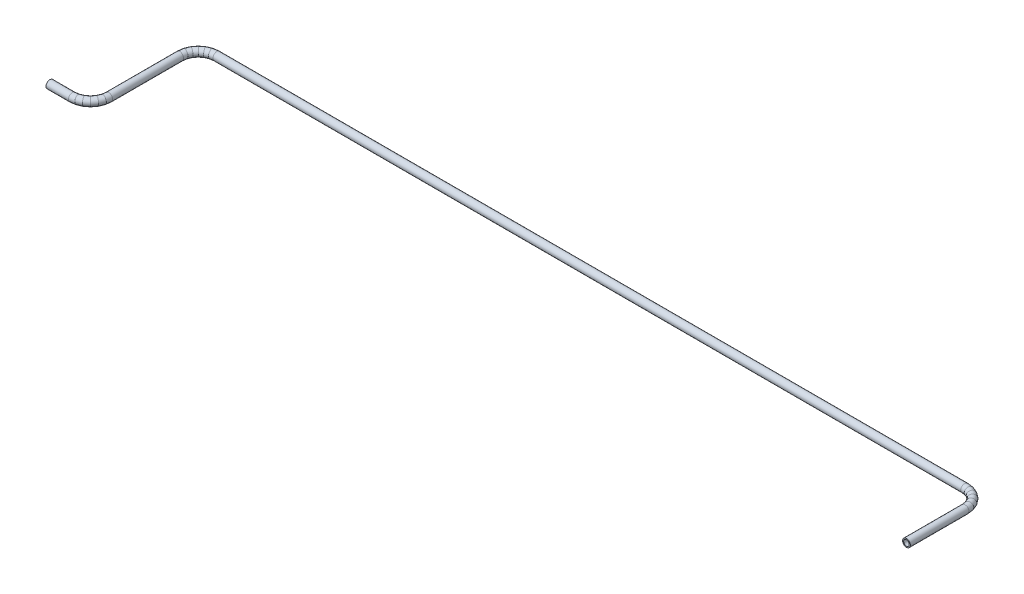
ISO-10303-21;
HEADER;
FILE_DESCRIPTION(('STEP AP214'),'2;1');
FILE_NAME('part.step','',(''),(''),'','','');
FILE_SCHEMA(('AUTOMOTIVE_DESIGN { 1 0 10303 214 1 1 1 1 }'));
ENDSEC;
DATA;
#1=APPLICATION_CONTEXT('core data for automotive mechanical design processes');
#2=APPLICATION_PROTOCOL_DEFINITION('international standard','automotive_design',2000,#1);
#3=PRODUCT_CONTEXT('',#1,'mechanical');
#4=PRODUCT('Part','Part','',(#3));
#5=PRODUCT_RELATED_PRODUCT_CATEGORY('part','',(#4));
#6=PRODUCT_DEFINITION_FORMATION('','',#4);
#7=PRODUCT_DEFINITION_CONTEXT('part definition',#1,'design');
#8=PRODUCT_DEFINITION('design','',#6,#7);
#9=PRODUCT_DEFINITION_SHAPE('','',#8);
#10=(LENGTH_UNIT() NAMED_UNIT(*) SI_UNIT(.MILLI.,.METRE.));
#11=(NAMED_UNIT(*) PLANE_ANGLE_UNIT() SI_UNIT($,.RADIAN.));
#12=(NAMED_UNIT(*) SI_UNIT($,.STERADIAN.) SOLID_ANGLE_UNIT());
#13=UNCERTAINTY_MEASURE_WITH_UNIT(LENGTH_MEASURE(1.E-05),#10,'distance_accuracy_value','');
#14=(GEOMETRIC_REPRESENTATION_CONTEXT(3) GLOBAL_UNCERTAINTY_ASSIGNED_CONTEXT((#13)) GLOBAL_UNIT_ASSIGNED_CONTEXT((#10,
#11,#12)) REPRESENTATION_CONTEXT('',''));
#15=CARTESIAN_POINT('',(0.,0.,0.));
#16=DIRECTION('',(0.,0.,1.));
#17=DIRECTION('',(1.,0.,0.));
#18=AXIS2_PLACEMENT_3D('',#15,#16,#17);
#19=CARTESIAN_POINT('',(-2911.59277838077,0.,-73.3289105438826));
#20=DIRECTION('',(0.,0.,1.));
#21=DIRECTION('',(0.,-1.,0.));
#22=AXIS2_PLACEMENT_3D('',#19,#20,#21);
#23=CYLINDRICAL_SURFACE('',#22,3.175);
#24=CARTESIAN_POINT('',(-2911.59277838077,0.,-73.0000000000001));
#25=DIRECTION('',(0.065403129230125,0.,0.997858923238605));
#26=DIRECTION('',(0.997858923238605,0.,-0.065403129230125));
#27=AXIS2_PLACEMENT_3D('',#24,#25,#26);
#28=ELLIPSE('',#27,3.18181250481317,3.175);
#29=CARTESIAN_POINT('',(-2908.41777838077,0.,-73.2081004944384));
#30=VERTEX_POINT('',#29);
#31=EDGE_CURVE('E45',#30,#30,#28,.F.);
#32=ORIENTED_EDGE('',*,*,#31,.F.);
#33=EDGE_LOOP('',(#32));
#34=FACE_BOUND('',#33,.T.);
#35=CARTESIAN_POINT('',(-2911.59277838077,0.,-25.299999999997));
#36=DIRECTION('',(0.,0.,1.));
#37=DIRECTION('',(1.,0.,0.));
#38=AXIS2_PLACEMENT_3D('',#35,#36,#37);
#39=CIRCLE('',#38,3.175);
#40=CARTESIAN_POINT('',(-2908.41777838077,0.,-25.299999999997));
#41=VERTEX_POINT('',#40);
#42=EDGE_CURVE('E116',#41,#41,#39,.T.);
#43=ORIENTED_EDGE('',*,*,#42,.F.);
#44=EDGE_LOOP('',(#43));
#45=FACE_BOUND('',#44,.T.);
#46=ADVANCED_FACE('F39',(#34,#45),#23,.T.);
#47=CARTESIAN_POINT('',(-2912.17695907214,0.,-77.4372928890044));
#48=DIRECTION('',(0.130526192220016,0.,0.991444861373815));
#49=DIRECTION('',(0.991444861373815,0.,-0.130526192220016));
#50=AXIS2_PLACEMENT_3D('',#47,#48,#49);
#51=CYLINDRICAL_SURFACE('',#50,3.175);
#52=CARTESIAN_POINT('',(-2912.10389098644,0.,-76.8822856765381));
#53=DIRECTION('',(0.258819045102501,0.,0.965925826289074));
#54=DIRECTION('',(0.965925826289074,0.,-0.258819045102501));
#55=AXIS2_PLACEMENT_3D('',#52,#53,#54);
#56=ELLIPSE('',#55,3.20239694984199,3.175);
#57=CARTESIAN_POINT('',(-2909.01061306656,0.,-77.7111269971354));
#58=VERTEX_POINT('',#57);
#59=EDGE_CURVE('E177',#58,#58,#56,.F.);
#60=ORIENTED_EDGE('',*,*,#59,.F.);
#61=EDGE_LOOP('',(#60));
#62=FACE_BOUND('',#61,.T.);
#63=ORIENTED_EDGE('',*,*,#31,.T.);
#64=EDGE_LOOP('',(#63));
#65=FACE_BOUND('',#64,.T.);
#66=ADVANCED_FACE('F183',(#62,#65),#51,.T.);
#67=CARTESIAN_POINT('',(-2913.81662211182,0.,-81.0171843881302));
#68=DIRECTION('',(0.382683432365085,0.,0.923879532511289));
#69=DIRECTION('',(0.923879532511289,0.,-0.382683432365085));
#70=AXIS2_PLACEMENT_3D('',#67,#68,#69);
#71=CYLINDRICAL_SURFACE('',#70,3.175);
#72=CARTESIAN_POINT('',(-2913.60239732401,0.,-80.5000000000008));
#73=DIRECTION('',(0.500000000000009,0.,0.866025403784433));
#74=DIRECTION('',(0.866025403784433,0.,-0.500000000000009));
#75=AXIS2_PLACEMENT_3D('',#72,#73,#74);
#76=ELLIPSE('',#75,3.20239694984199,3.175);
#77=CARTESIAN_POINT('',(-2910.82904021244,0.,-82.1011984749218));
#78=VERTEX_POINT('',#77);
#79=EDGE_CURVE('E176',#78,#78,#76,.F.);
#80=ORIENTED_EDGE('',*,*,#79,.F.);
#81=EDGE_LOOP('',(#80));
#82=FACE_BOUND('',#81,.T.);
#83=ORIENTED_EDGE('',*,*,#59,.T.);
#84=EDGE_LOOP('',(#83));
#85=FACE_BOUND('',#84,.T.);
#86=ADVANCED_FACE('F602',(#82,#85),#71,.T.);
#87=CARTESIAN_POINT('',(-2916.32695908763,0.,-84.0507180202281));
#88=DIRECTION('',(0.608761429008742,0.,0.793353340291219));
#89=DIRECTION('',(0.793353340291219,0.,-0.608761429008742));
#90=AXIS2_PLACEMENT_3D('',#87,#88,#89);
#91=CYLINDRICAL_SURFACE('',#90,3.175);
#92=CARTESIAN_POINT('',(-2915.98617666298,0.,-83.6066017177989));
#93=DIRECTION('',(0.707106781186549,0.,0.707106781186546));
#94=DIRECTION('',(0.707106781186546,0.,-0.707106781186549));
#95=AXIS2_PLACEMENT_3D('',#92,#93,#94);
#96=ELLIPSE('',#95,3.20239694984198,3.175);
#97=CARTESIAN_POINT('',(-2913.72174006369,0.,-85.8710383170833));
#98=VERTEX_POINT('',#97);
#99=EDGE_CURVE('E174',#98,#98,#96,.F.);
#100=ORIENTED_EDGE('',*,*,#99,.F.);
#101=EDGE_LOOP('',(#100));
#102=FACE_BOUND('',#101,.T.);
#103=ORIENTED_EDGE('',*,*,#79,.T.);
#104=EDGE_LOOP('',(#103));
#105=FACE_BOUND('',#104,.T.);
#106=ADVANCED_FACE('F592',(#102,#105),#91,.T.);
#107=CARTESIAN_POINT('',(-2919.5368946832,0.,-86.331163481423));
#108=DIRECTION('',(0.793353340291223,0.,0.608761429008737));
#109=DIRECTION('',(0.608761429008737,0.,-0.793353340291223));
#110=AXIS2_PLACEMENT_3D('',#107,#108,#109);
#111=CYLINDRICAL_SURFACE('',#110,3.175);
#112=CARTESIAN_POINT('',(-2919.09277838077,0.,-85.9903810567672));
#113=DIRECTION('',(0.866025403784438,0.,0.500000000000001));
#114=DIRECTION('',(0.500000000000001,0.,-0.866025403784438));
#115=AXIS2_PLACEMENT_3D('',#112,#113,#114);
#116=ELLIPSE('',#115,3.20239694984199,3.175);
#117=CARTESIAN_POINT('',(-2917.49157990585,0.,-88.7637381683321));
#118=VERTEX_POINT('',#117);
#119=EDGE_CURVE('E168',#118,#118,#116,.F.);
#120=ORIENTED_EDGE('',*,*,#119,.F.);
#121=EDGE_LOOP('',(#120));
#122=FACE_BOUND('',#121,.T.);
#123=ORIENTED_EDGE('',*,*,#99,.T.);
#124=EDGE_LOOP('',(#123));
#125=FACE_BOUND('',#124,.T.);
#126=ADVANCED_FACE('F584',(#122,#125),#111,.T.);
#127=CARTESIAN_POINT('',(-2923.22767709237,0.,-87.7031121821474));
#128=DIRECTION('',(0.923879532511294,0.,0.382683432365073));
#129=DIRECTION('',(0.382683432365073,0.,-0.923879532511294));
#130=AXIS2_PLACEMENT_3D('',#127,#128,#129);
#131=CYLINDRICAL_SURFACE('',#130,3.175);
#132=CARTESIAN_POINT('',(-2922.71049270424,0.,-87.4888873943369));
#133=DIRECTION('',(0.965925826289071,0.,0.25881904510251));
#134=DIRECTION('',(0.25881904510251,0.,-0.965925826289071));
#135=AXIS2_PLACEMENT_3D('',#132,#133,#134);
#136=ELLIPSE('',#135,3.20239694984198,3.175);
#137=CARTESIAN_POINT('',(-2921.88165138364,0.,-90.5821653142186));
#138=VERTEX_POINT('',#137);
#139=EDGE_CURVE('E170',#138,#138,#136,.F.);
#140=ORIENTED_EDGE('',*,*,#139,.F.);
#141=EDGE_LOOP('',(#140));
#142=FACE_BOUND('',#141,.T.);
#143=ORIENTED_EDGE('',*,*,#119,.T.);
#144=EDGE_LOOP('',(#143));
#145=FACE_BOUND('',#144,.T.);
#146=ADVANCED_FACE('F576',(#142,#145),#131,.T.);
#147=CARTESIAN_POINT('',(-2926.91887504936,0.,-88.0429314408749));
#148=DIRECTION('',(0.991444861373811,0.,0.130526192220047));
#149=DIRECTION('',(0.130526192220047,0.,-0.991444861373811));
#150=AXIS2_PLACEMENT_3D('',#147,#148,#149);
#151=CYLINDRICAL_SURFACE('',#150,3.175);
#152=CARTESIAN_POINT('',(-2926.59277838077,0.,-88.0000000000009));
#153=DIRECTION('',(0.997858923238604,0.,0.0654031292301407));
#154=DIRECTION('',(0.0654031292301407,0.,-0.997858923238604));
#155=AXIS2_PLACEMENT_3D('',#152,#153,#154);
#156=ELLIPSE('',#155,3.18181250481318,3.175);
#157=CARTESIAN_POINT('',(-2926.38467788634,0.,-91.1750000000008));
#158=VERTEX_POINT('',#157);
#159=EDGE_CURVE('E163',#158,#158,#156,.F.);
#160=ORIENTED_EDGE('',*,*,#159,.F.);
#161=EDGE_LOOP('',(#160));
#162=FACE_BOUND('',#161,.T.);
#163=ORIENTED_EDGE('',*,*,#139,.T.);
#164=EDGE_LOOP('',(#163));
#165=FACE_BOUND('',#164,.T.);
#166=ADVANCED_FACE('F570',(#162,#165),#151,.T.);
#167=CARTESIAN_POINT('',(-3538.02168892466,0.,-88.0000000000009));
#168=DIRECTION('',(1.,0.,0.));
#169=DIRECTION('',(0.,0.,-1.));
#170=AXIS2_PLACEMENT_3D('',#167,#168,#169);
#171=CYLINDRICAL_SURFACE('',#170,3.175);
#172=CARTESIAN_POINT('',(-3537.69277838077,0.,-88.0000000000005));
#173=DIRECTION('',(0.997858923238603,0.,-0.0654031292301481));
#174=DIRECTION('',(-0.0654031292301481,0.,-0.997858923238603));
#175=AXIS2_PLACEMENT_3D('',#172,#173,#174);
#176=ELLIPSE('',#175,3.18181250481318,3.175);
#177=CARTESIAN_POINT('',(-3537.90087887521,0.,-91.1750000000005));
#178=VERTEX_POINT('',#177);
#179=EDGE_CURVE('E161',#178,#178,#176,.F.);
#180=ORIENTED_EDGE('',*,*,#179,.F.);
#181=EDGE_LOOP('',(#180));
#182=FACE_BOUND('',#181,.T.);
#183=ORIENTED_EDGE('',*,*,#159,.T.);
#184=EDGE_LOOP('',(#183));
#185=FACE_BOUND('',#184,.T.);
#186=ADVANCED_FACE('F559',(#182,#185),#171,.T.);
#187=CARTESIAN_POINT('',(-3542.13007126978,0.,-87.4158193086363));
#188=DIRECTION('',(0.991444861373809,0.,-0.130526192220062));
#189=DIRECTION('',(-0.130526192220062,0.,-0.991444861373809));
#190=AXIS2_PLACEMENT_3D('',#187,#188,#189);
#191=CYLINDRICAL_SURFACE('',#190,3.175);
#192=CARTESIAN_POINT('',(-3541.57506405731,0.,-87.4888873943367));
#193=DIRECTION('',(0.965925826289069,0.,-0.258819045102517));
#194=DIRECTION('',(-0.258819045102517,0.,-0.965925826289069));
#195=AXIS2_PLACEMENT_3D('',#192,#193,#194);
#196=ELLIPSE('',#195,3.20239694984198,3.175);
#197=CARTESIAN_POINT('',(-3542.40390537791,0.,-90.5821653142184));
#198=VERTEX_POINT('',#197);
#199=EDGE_CURVE('E158',#198,#198,#196,.F.);
#200=ORIENTED_EDGE('',*,*,#199,.F.);
#201=EDGE_LOOP('',(#200));
#202=FACE_BOUND('',#201,.T.);
#203=ORIENTED_EDGE('',*,*,#179,.T.);
#204=EDGE_LOOP('',(#203));
#205=FACE_BOUND('',#204,.T.);
#206=ADVANCED_FACE('F548',(#202,#205),#191,.T.);
#207=CARTESIAN_POINT('',(-3545.7099627689,0.,-85.7761562689563));
#208=DIRECTION('',(0.923879532511294,0.,-0.382683432365073));
#209=DIRECTION('',(-0.382683432365073,0.,-0.923879532511294));
#210=AXIS2_PLACEMENT_3D('',#207,#208,#209);
#211=CYLINDRICAL_SURFACE('',#210,3.175);
#212=CARTESIAN_POINT('',(-3545.19277838077,0.,-85.9903810567662));
#213=DIRECTION('',(0.866025403784438,0.,-0.500000000000001));
#214=DIRECTION('',(-0.500000000000001,0.,-0.866025403784438));
#215=AXIS2_PLACEMENT_3D('',#212,#213,#214);
#216=ELLIPSE('',#215,3.20239694984199,3.175);
#217=CARTESIAN_POINT('',(-3546.7939768557,0.,-88.7637381683311));
#218=VERTEX_POINT('',#217);
#219=EDGE_CURVE('E154',#218,#218,#216,.F.);
#220=ORIENTED_EDGE('',*,*,#219,.F.);
#221=EDGE_LOOP('',(#220));
#222=FACE_BOUND('',#221,.T.);
#223=ORIENTED_EDGE('',*,*,#199,.T.);
#224=EDGE_LOOP('',(#223));
#225=FACE_BOUND('',#224,.T.);
#226=ADVANCED_FACE('F539',(#222,#225),#211,.T.);
#227=CARTESIAN_POINT('',(-3548.743496401,0.,-83.2658192931421));
#228=DIRECTION('',(0.793353340291223,0.,-0.608761429008737));
#229=DIRECTION('',(-0.608761429008737,0.,-0.793353340291223));
#230=AXIS2_PLACEMENT_3D('',#227,#228,#229);
#231=CYLINDRICAL_SURFACE('',#230,3.175);
#232=CARTESIAN_POINT('',(-3548.29938009857,0.,-83.6066017177982));
#233=DIRECTION('',(0.70710678118655,0.,-0.707106781186545));
#234=DIRECTION('',(-0.707106781186545,0.,-0.70710678118655));
#235=AXIS2_PLACEMENT_3D('',#232,#233,#234);
#236=ELLIPSE('',#235,3.20239694984197,3.175);
#237=CARTESIAN_POINT('',(-3550.56381669786,0.,-85.8710383170826));
#238=VERTEX_POINT('',#237);
#239=EDGE_CURVE('E155',#238,#238,#236,.F.);
#240=ORIENTED_EDGE('',*,*,#239,.F.);
#241=EDGE_LOOP('',(#240));
#242=FACE_BOUND('',#241,.T.);
#243=ORIENTED_EDGE('',*,*,#219,.T.);
#244=EDGE_LOOP('',(#243));
#245=FACE_BOUND('',#244,.T.);
#246=ADVANCED_FACE('F533',(#242,#245),#231,.T.);
#247=CARTESIAN_POINT('',(-3551.0239418622,0.,-80.0558836975709));
#248=DIRECTION('',(0.608761429008742,0.,-0.793353340291219));
#249=DIRECTION('',(-0.793353340291219,0.,-0.608761429008742));
#250=AXIS2_PLACEMENT_3D('',#247,#248,#249);
#251=CYLINDRICAL_SURFACE('',#250,3.175);
#252=CARTESIAN_POINT('',(-3550.68315943754,0.,-80.4999999999997));
#253=DIRECTION('',(0.500000000000009,0.,-0.866025403784433));
#254=DIRECTION('',(-0.866025403784433,0.,-0.500000000000009));
#255=AXIS2_PLACEMENT_3D('',#252,#253,#254);
#256=ELLIPSE('',#255,3.20239694984199,3.175);
#257=CARTESIAN_POINT('',(-3553.45651654911,0.,-82.1011984749208));
#258=VERTEX_POINT('',#257);
#259=EDGE_CURVE('E149',#258,#258,#256,.F.);
#260=ORIENTED_EDGE('',*,*,#259,.F.);
#261=EDGE_LOOP('',(#260));
#262=FACE_BOUND('',#261,.T.);
#263=ORIENTED_EDGE('',*,*,#239,.T.);
#264=EDGE_LOOP('',(#263));
#265=FACE_BOUND('',#264,.T.);
#266=ADVANCED_FACE('F525',(#262,#265),#251,.T.);
#267=CARTESIAN_POINT('',(-3552.39589056292,0.,-76.3651012884083));
#268=DIRECTION('',(0.382683432365085,0.,-0.923879532511289));
#269=DIRECTION('',(-0.923879532511289,0.,-0.382683432365085));
#270=AXIS2_PLACEMENT_3D('',#267,#268,#269);
#271=CYLINDRICAL_SURFACE('',#270,3.175);
#272=CARTESIAN_POINT('',(-3552.18166577511,0.,-76.8822856765375));
#273=DIRECTION('',(0.258819045102501,0.,-0.965925826289074));
#274=DIRECTION('',(-0.965925826289074,0.,-0.258819045102501));
#275=AXIS2_PLACEMENT_3D('',#272,#273,#274);
#276=ELLIPSE('',#275,3.20239694984199,3.175);
#277=CARTESIAN_POINT('',(-3555.27494369499,0.,-77.7111269971348));
#278=VERTEX_POINT('',#277);
#279=EDGE_CURVE('E148',#278,#278,#276,.F.);
#280=ORIENTED_EDGE('',*,*,#279,.F.);
#281=EDGE_LOOP('',(#280));
#282=FACE_BOUND('',#281,.T.);
#283=ORIENTED_EDGE('',*,*,#259,.T.);
#284=EDGE_LOOP('',(#283));
#285=FACE_BOUND('',#284,.T.);
#286=ADVANCED_FACE('F511',(#282,#285),#271,.T.);
#287=CARTESIAN_POINT('',(-3552.73570982165,0.,-72.6739033314159));
#288=DIRECTION('',(0.130526192220016,0.,-0.991444861373815));
#289=DIRECTION('',(-0.991444861373815,0.,-0.130526192220016));
#290=AXIS2_PLACEMENT_3D('',#287,#288,#289);
#291=CYLINDRICAL_SURFACE('',#290,3.175);
#292=CARTESIAN_POINT('',(-3552.69277838077,0.,-72.9999999999999));
#293=DIRECTION('',(0.065403129230125,0.,-0.997858923238605));
#294=DIRECTION('',(-0.997858923238605,0.,-0.065403129230125));
#295=AXIS2_PLACEMENT_3D('',#292,#293,#294);
#296=ELLIPSE('',#295,3.18181250481317,3.175);
#297=CARTESIAN_POINT('',(-3555.86777838077,0.,-73.2081004944383));
#298=VERTEX_POINT('',#297);
#299=EDGE_CURVE('E141',#298,#298,#296,.F.);
#300=ORIENTED_EDGE('',*,*,#299,.F.);
#301=EDGE_LOOP('',(#300));
#302=FACE_BOUND('',#301,.T.);
#303=ORIENTED_EDGE('',*,*,#279,.T.);
#304=EDGE_LOOP('',(#303));
#305=FACE_BOUND('',#304,.T.);
#306=ADVANCED_FACE('F501',(#302,#305),#291,.T.);
#307=CARTESIAN_POINT('',(-3552.69277838077,0.,-14.6710894561175));
#308=DIRECTION('',(0.,0.,-1.));
#309=DIRECTION('',(0.,1.,0.));
#310=AXIS2_PLACEMENT_3D('',#307,#308,#309);
#311=CYLINDRICAL_SURFACE('',#310,3.175);
#312=CARTESIAN_POINT('',(-3552.69277838077,0.,-14.9999999999999));
#313=DIRECTION('',(0.0654031292301811,0.,-0.997858923238601));
#314=DIRECTION('',(0.997858923238601,0.,0.0654031292301811));
#315=AXIS2_PLACEMENT_3D('',#312,#313,#314);
#316=ELLIPSE('',#315,3.18181250481318,3.175);
#317=CARTESIAN_POINT('',(-3549.51777838077,0.,-14.7918995055614));
#318=VERTEX_POINT('',#317);
#319=EDGE_CURVE('E139',#318,#318,#316,.F.);
#320=ORIENTED_EDGE('',*,*,#319,.F.);
#321=EDGE_LOOP('',(#320));
#322=FACE_BOUND('',#321,.T.);
#323=ORIENTED_EDGE('',*,*,#299,.T.);
#324=EDGE_LOOP('',(#323));
#325=FACE_BOUND('',#324,.T.);
#326=ADVANCED_FACE('F494',(#322,#325),#311,.T.);
#327=CARTESIAN_POINT('',(-3553.27695907214,0.,-10.5627071109957));
#328=DIRECTION('',(0.130526192220127,0.,-0.991444861373801));
#329=DIRECTION('',(-0.991444861373801,0.,-0.130526192220127));
#330=AXIS2_PLACEMENT_3D('',#327,#328,#329);
#331=CYLINDRICAL_SURFACE('',#330,3.175);
#332=CARTESIAN_POINT('',(-3553.20389098644,0.,-11.1177143234617));
#333=DIRECTION('',(0.258819045102555,0.,-0.965925826289059));
#334=DIRECTION('',(0.965925826289059,0.,0.258819045102555));
#335=AXIS2_PLACEMENT_3D('',#332,#333,#334);
#336=ELLIPSE('',#335,3.20239694984197,3.175);
#337=CARTESIAN_POINT('',(-3550.11061306656,0.,-10.2888730028642));
#338=VERTEX_POINT('',#337);
#339=EDGE_CURVE('E140',#338,#338,#336,.F.);
#340=ORIENTED_EDGE('',*,*,#339,.F.);
#341=EDGE_LOOP('',(#340));
#342=FACE_BOUND('',#341,.T.);
#343=ORIENTED_EDGE('',*,*,#319,.T.);
#344=EDGE_LOOP('',(#343));
#345=FACE_BOUND('',#344,.T.);
#346=ADVANCED_FACE('F486',(#342,#345),#331,.T.);
#347=CARTESIAN_POINT('',(-3554.91662211182,0.,-6.98281561186986));
#348=DIRECTION('',(0.382683432365086,0.,-0.923879532511288));
#349=DIRECTION('',(-0.923879532511289,0.,-0.382683432365086));
#350=AXIS2_PLACEMENT_3D('',#347,#348,#349);
#351=CYLINDRICAL_SURFACE('',#350,3.175);
#352=CARTESIAN_POINT('',(-3554.70239732401,0.,-7.49999999999945));
#353=DIRECTION('',(0.49999999999997,0.,-0.866025403784456));
#354=DIRECTION('',(0.866025403784456,0.,0.49999999999997));
#355=AXIS2_PLACEMENT_3D('',#352,#353,#354);
#356=ELLIPSE('',#355,3.20239694984197,3.175);
#357=CARTESIAN_POINT('',(-3551.92904021244,0.,-5.89880152507856));
#358=VERTEX_POINT('',#357);
#359=EDGE_CURVE('E131',#358,#358,#356,.F.);
#360=ORIENTED_EDGE('',*,*,#359,.F.);
#361=EDGE_LOOP('',(#360));
#362=FACE_BOUND('',#361,.T.);
#363=ORIENTED_EDGE('',*,*,#339,.T.);
#364=EDGE_LOOP('',(#363));
#365=FACE_BOUND('',#364,.T.);
#366=ADVANCED_FACE('F480',(#362,#365),#351,.T.);
#367=CARTESIAN_POINT('',(-3557.42695908763,0.,-3.94928197977196));
#368=DIRECTION('',(0.60876142900867,0.,-0.793353340291274));
#369=DIRECTION('',(-0.793353340291274,0.,-0.60876142900867));
#370=AXIS2_PLACEMENT_3D('',#367,#368,#369);
#371=CYLINDRICAL_SURFACE('',#370,3.175);
#372=CARTESIAN_POINT('',(-3557.08617666298,0.,-4.39339828220139));
#373=DIRECTION('',(0.707106781186542,0.,-0.707106781186553));
#374=DIRECTION('',(0.707106781186553,0.,0.707106781186542));
#375=AXIS2_PLACEMENT_3D('',#372,#373,#374);
#376=ELLIPSE('',#375,3.20239694984201,3.175);
#377=CARTESIAN_POINT('',(-3554.82174006369,0.,-2.12896168291701));
#378=VERTEX_POINT('',#377);
#379=EDGE_CURVE('E132',#378,#378,#376,.F.);
#380=ORIENTED_EDGE('',*,*,#379,.F.);
#381=EDGE_LOOP('',(#380));
#382=FACE_BOUND('',#381,.T.);
#383=ORIENTED_EDGE('',*,*,#359,.T.);
#384=EDGE_LOOP('',(#383));
#385=FACE_BOUND('',#384,.T.);
#386=ADVANCED_FACE('F467',(#382,#385),#371,.T.);
#387=CARTESIAN_POINT('',(-3560.6368946832,0.,-1.66883651857797));
#388=DIRECTION('',(0.793353340291265,0.,-0.608761429008682));
#389=DIRECTION('',(-0.608761429008682,0.,-0.793353340291265));
#390=AXIS2_PLACEMENT_3D('',#387,#388,#389);
#391=CYLINDRICAL_SURFACE('',#390,3.175);
#392=CARTESIAN_POINT('',(-3560.19277838077,0.,-2.00961894323346));
#393=DIRECTION('',(0.866025403784444,0.,-0.49999999999999));
#394=DIRECTION('',(0.49999999999999,0.,0.866025403784444));
#395=AXIS2_PLACEMENT_3D('',#392,#393,#394);
#396=ELLIPSE('',#395,3.20239694984197,3.175);
#397=CARTESIAN_POINT('',(-3558.59157990585,0.,0.763738168331504));
#398=VERTEX_POINT('',#397);
#399=EDGE_CURVE('E126',#398,#398,#396,.F.);
#400=ORIENTED_EDGE('',*,*,#399,.F.);
#401=EDGE_LOOP('',(#400));
#402=FACE_BOUND('',#401,.T.);
#403=ORIENTED_EDGE('',*,*,#379,.T.);
#404=EDGE_LOOP('',(#403));
#405=FACE_BOUND('',#404,.T.);
#406=ADVANCED_FACE('F459',(#402,#405),#391,.T.);
#407=CARTESIAN_POINT('',(-3564.32767709237,0.,-0.296887817853309));
#408=DIRECTION('',(0.923879532511277,0.,-0.382683432365114));
#409=DIRECTION('',(-0.382683432365114,0.,-0.923879532511277));
#410=AXIS2_PLACEMENT_3D('',#407,#408,#409);
#411=CYLINDRICAL_SURFACE('',#410,3.175);
#412=CARTESIAN_POINT('',(-3563.81049270424,0.,-0.511112605663966));
#413=DIRECTION('',(0.965925826289065,0.,-0.258819045102532));
#414=DIRECTION('',(0.258819045102532,0.,0.965925826289065));
#415=AXIS2_PLACEMENT_3D('',#412,#413,#414);
#416=ELLIPSE('',#415,3.20239694984199,3.175);
#417=CARTESIAN_POINT('',(-3562.98165138364,0.,2.58216531421774));
#418=VERTEX_POINT('',#417);
#419=EDGE_CURVE('E124',#418,#418,#416,.F.);
#420=ORIENTED_EDGE('',*,*,#419,.F.);
#421=EDGE_LOOP('',(#420));
#422=FACE_BOUND('',#421,.T.);
#423=ORIENTED_EDGE('',*,*,#399,.T.);
#424=EDGE_LOOP('',(#423));
#425=FACE_BOUND('',#424,.T.);
#426=ADVANCED_FACE('F448',(#422,#425),#411,.T.);
#427=CARTESIAN_POINT('',(-3568.01887504936,0.,0.0429314408739723));
#428=DIRECTION('',(0.991444861373811,0.,-0.130526192220048));
#429=DIRECTION('',(-0.130526192220048,0.,-0.991444861373811));
#430=AXIS2_PLACEMENT_3D('',#427,#428,#429);
#431=CYLINDRICAL_SURFACE('',#430,3.175);
#432=CARTESIAN_POINT('',(-3567.69277838077,0.,0.));
#433=DIRECTION('',(0.997858923238604,0.,-0.0654031292301411));
#434=DIRECTION('',(0.0654031292301411,0.,0.997858923238604));
#435=AXIS2_PLACEMENT_3D('',#432,#433,#434);
#436=ELLIPSE('',#435,3.18181250481318,3.175);
#437=CARTESIAN_POINT('',(-3567.48467788634,0.,3.175));
#438=VERTEX_POINT('',#437);
#439=EDGE_CURVE('E125',#438,#438,#436,.F.);
#440=ORIENTED_EDGE('',*,*,#439,.F.);
#441=EDGE_LOOP('',(#440));
#442=FACE_BOUND('',#441,.T.);
#443=ORIENTED_EDGE('',*,*,#419,.T.);
#444=EDGE_LOOP('',(#443));
#445=FACE_BOUND('',#444,.T.);
#446=ADVANCED_FACE('F204',(#442,#445),#431,.T.);
#447=CARTESIAN_POINT('',(-3585.89277838077,0.,0.));
#448=DIRECTION('',(1.,0.,0.));
#449=DIRECTION('',(0.,0.,-1.));
#450=AXIS2_PLACEMENT_3D('',#447,#448,#449);
#451=CYLINDRICAL_SURFACE('',#450,3.175);
#452=CARTESIAN_POINT('',(-3585.89277838077,0.,0.));
#453=DIRECTION('',(1.,0.,0.));
#454=DIRECTION('',(0.,0.,-1.));
#455=AXIS2_PLACEMENT_3D('',#452,#453,#454);
#456=CIRCLE('',#455,3.175);
#457=CARTESIAN_POINT('',(-3585.89277838077,0.,-3.175));
#458=VERTEX_POINT('',#457);
#459=EDGE_CURVE('E117',#458,#458,#456,.T.);
#460=ORIENTED_EDGE('',*,*,#459,.T.);
#461=EDGE_LOOP('',(#460));
#462=FACE_BOUND('',#461,.T.);
#463=ORIENTED_EDGE('',*,*,#439,.T.);
#464=EDGE_LOOP('',(#463));
#465=FACE_BOUND('',#464,.T.);
#466=ADVANCED_FACE('F193',(#462,#465),#451,.T.);
#467=CARTESIAN_POINT('',(-2911.59277838077,0.,-25.299999999997));
#468=DIRECTION('',(0.,0.,1.));
#469=DIRECTION('',(1.,0.,0.));
#470=AXIS2_PLACEMENT_3D('',#467,#468,#469);
#471=PLANE('',#470);
#472=CARTESIAN_POINT('',(-2911.59277838077,0.,-25.299999999997));
#473=DIRECTION('',(0.,0.,1.));
#474=DIRECTION('',(1.,0.,0.));
#475=AXIS2_PLACEMENT_3D('',#472,#473,#474);
#476=CIRCLE('',#475,2.286);
#477=CARTESIAN_POINT('',(-2909.30677838077,0.,-25.299999999997));
#478=VERTEX_POINT('',#477);
#479=EDGE_CURVE('E114',#478,#478,#476,.F.);
#480=ORIENTED_EDGE('',*,*,#479,.T.);
#481=EDGE_LOOP('',(#480));
#482=FACE_BOUND('',#481,.T.);
#483=ORIENTED_EDGE('',*,*,#42,.T.);
#484=EDGE_LOOP('',(#483));
#485=FACE_BOUND('',#484,.T.);
#486=ADVANCED_FACE('F191',(#482,#485),#471,.T.);
#487=CARTESIAN_POINT('',(-3585.89277838077,0.,0.));
#488=DIRECTION('',(1.,0.,0.));
#489=DIRECTION('',(0.,0.,-1.));
#490=AXIS2_PLACEMENT_3D('',#487,#488,#489);
#491=PLANE('',#490);
#492=CARTESIAN_POINT('',(-3585.89277838077,0.,0.));
#493=DIRECTION('',(1.,0.,0.));
#494=DIRECTION('',(0.,0.,-1.));
#495=AXIS2_PLACEMENT_3D('',#492,#493,#494);
#496=CIRCLE('',#495,2.286);
#497=CARTESIAN_POINT('',(-3585.89277838077,0.,-2.286));
#498=VERTEX_POINT('',#497);
#499=EDGE_CURVE('E46',#498,#498,#496,.F.);
#500=ORIENTED_EDGE('',*,*,#499,.F.);
#501=EDGE_LOOP('',(#500));
#502=FACE_BOUND('',#501,.T.);
#503=ORIENTED_EDGE('',*,*,#459,.F.);
#504=EDGE_LOOP('',(#503));
#505=FACE_BOUND('',#504,.T.);
#506=ADVANCED_FACE('F192',(#502,#505),#491,.F.);
#507=CARTESIAN_POINT('',(-2911.59277838077,0.,-73.2648155915956));
#508=DIRECTION('',(0.,0.,1.));
#509=DIRECTION('',(0.,-1.,0.));
#510=AXIS2_PLACEMENT_3D('',#507,#508,#509);
#511=CYLINDRICAL_SURFACE('',#510,2.286);
#512=CARTESIAN_POINT('',(-2911.59277838077,0.,-73.0000000000001));
#513=DIRECTION('',(0.065403129230125,0.,0.997858923238605));
#514=DIRECTION('',(0.997858923238605,0.,-0.065403129230125));
#515=AXIS2_PLACEMENT_3D('',#512,#513,#514);
#516=ELLIPSE('',#515,2.29090500346548,2.286);
#517=CARTESIAN_POINT('',(-2909.30677838077,0.,-73.1498323559957));
#518=VERTEX_POINT('',#517);
#519=EDGE_CURVE('E109',#518,#518,#516,.T.);
#520=ORIENTED_EDGE('',*,*,#519,.F.);
#521=EDGE_LOOP('',(#520));
#522=FACE_BOUND('',#521,.T.);
#523=ORIENTED_EDGE('',*,*,#479,.F.);
#524=EDGE_LOOP('',(#523));
#525=FACE_BOUND('',#524,.T.);
#526=ADVANCED_FACE('F203',(#522,#525),#511,.F.);
#527=CARTESIAN_POINT('',(-2912.16015474152,0.,-77.3096513256326));
#528=DIRECTION('',(0.130526192220016,0.,0.991444861373815));
#529=DIRECTION('',(0.991444861373815,0.,-0.130526192220016));
#530=AXIS2_PLACEMENT_3D('',#527,#528,#529);
#531=CYLINDRICAL_SURFACE('',#530,2.286);
#532=CARTESIAN_POINT('',(-2912.10389098644,0.,-76.8822856765381));
#533=DIRECTION('',(0.258819045102501,0.,0.965925826289074));
#534=DIRECTION('',(0.965925826289074,0.,-0.258819045102501));
#535=AXIS2_PLACEMENT_3D('',#532,#533,#534);
#536=ELLIPSE('',#535,2.30572580388623,2.286);
#537=CARTESIAN_POINT('',(-2909.87673088412,0.,-77.4790514273681));
#538=VERTEX_POINT('',#537);
#539=EDGE_CURVE('E110',#538,#538,#536,.T.);
#540=ORIENTED_EDGE('',*,*,#539,.F.);
#541=EDGE_LOOP('',(#540));
#542=FACE_BOUND('',#541,.T.);
#543=ORIENTED_EDGE('',*,*,#519,.T.);
#544=EDGE_LOOP('',(#543));
#545=FACE_BOUND('',#544,.T.);
#546=ADVANCED_FACE('F288',(#542,#545),#531,.F.);
#547=CARTESIAN_POINT('',(-2913.76735430734,0.,-80.8982413863646));
#548=DIRECTION('',(0.382683432365085,0.,0.923879532511289));
#549=DIRECTION('',(0.923879532511289,0.,-0.382683432365085));
#550=AXIS2_PLACEMENT_3D('',#547,#548,#549);
#551=CYLINDRICAL_SURFACE('',#550,2.286);
#552=CARTESIAN_POINT('',(-2913.60239732401,0.,-80.5000000000008));
#553=DIRECTION('',(0.500000000000009,0.,0.866025403784433));
#554=DIRECTION('',(0.866025403784433,0.,-0.500000000000009));
#555=AXIS2_PLACEMENT_3D('',#552,#553,#554);
#556=ELLIPSE('',#555,2.30572580388623,2.286);
#557=CARTESIAN_POINT('',(-2911.60558020368,0.,-81.6528629019439));
#558=VERTEX_POINT('',#557);
#559=EDGE_CURVE('E102',#558,#558,#556,.T.);
#560=ORIENTED_EDGE('',*,*,#559,.F.);
#561=EDGE_LOOP('',(#560));
#562=FACE_BOUND('',#561,.T.);
#563=ORIENTED_EDGE('',*,*,#539,.T.);
#564=EDGE_LOOP('',(#563));
#565=FACE_BOUND('',#564,.T.);
#566=ADVANCED_FACE('F283',(#562,#565),#551,.F.);
#567=CARTESIAN_POINT('',(-2916.24858532874,0.,-83.9485793490762));
#568=DIRECTION('',(0.608761429008741,0.,0.793353340291219));
#569=DIRECTION('',(0.793353340291219,0.,-0.608761429008742));
#570=AXIS2_PLACEMENT_3D('',#567,#568,#569);
#571=CYLINDRICAL_SURFACE('',#570,2.286);
#572=CARTESIAN_POINT('',(-2915.98617666298,0.,-83.6066017177989));
#573=DIRECTION('',(0.707106781186549,0.,0.707106781186545));
#574=DIRECTION('',(0.707106781186546,0.,-0.70710678118655));
#575=AXIS2_PLACEMENT_3D('',#572,#573,#574);
#576=ELLIPSE('',#575,2.30572580388622,2.286);
#577=CARTESIAN_POINT('',(-2914.35578231149,0.,-85.2369960692837));
#578=VERTEX_POINT('',#577);
#579=EDGE_CURVE('E101',#578,#578,#576,.T.);
#580=ORIENTED_EDGE('',*,*,#579,.F.);
#581=EDGE_LOOP('',(#580));
#582=FACE_BOUND('',#581,.T.);
#583=ORIENTED_EDGE('',*,*,#559,.T.);
#584=EDGE_LOOP('',(#583));
#585=FACE_BOUND('',#584,.T.);
#586=ADVANCED_FACE('F282',(#582,#585),#571,.F.);
#587=CARTESIAN_POINT('',(-2919.43475601205,0.,-86.2527897225318));
#588=DIRECTION('',(0.793353340291223,0.,0.608761429008737));
#589=DIRECTION('',(0.608761429008737,0.,-0.793353340291223));
#590=AXIS2_PLACEMENT_3D('',#587,#588,#589);
#591=CYLINDRICAL_SURFACE('',#590,2.286);
#592=CARTESIAN_POINT('',(-2919.09277838077,0.,-85.9903810567672));
#593=DIRECTION('',(0.866025403784438,0.,0.500000000000001));
#594=DIRECTION('',(0.500000000000001,0.,-0.866025403784438));
#595=AXIS2_PLACEMENT_3D('',#592,#593,#594);
#596=ELLIPSE('',#595,2.30572580388623,2.286);
#597=CARTESIAN_POINT('',(-2917.93991547883,0.,-87.987198177094));
#598=VERTEX_POINT('',#597);
#599=EDGE_CURVE('E98',#598,#598,#596,.T.);
#600=ORIENTED_EDGE('',*,*,#599,.F.);
#601=EDGE_LOOP('',(#600));
#602=FACE_BOUND('',#601,.T.);
#603=ORIENTED_EDGE('',*,*,#579,.T.);
#604=EDGE_LOOP('',(#603));
#605=FACE_BOUND('',#604,.T.);
#606=ADVANCED_FACE('F280',(#602,#605),#591,.F.);
#607=CARTESIAN_POINT('',(-2923.1087340906,0.,-87.6538443776667));
#608=DIRECTION('',(0.923879532511294,0.,0.382683432365073));
#609=DIRECTION('',(0.382683432365073,0.,-0.923879532511294));
#610=AXIS2_PLACEMENT_3D('',#607,#608,#609);
#611=CYLINDRICAL_SURFACE('',#610,2.286);
#612=CARTESIAN_POINT('',(-2922.71049270424,0.,-87.4888873943369));
#613=DIRECTION('',(0.965925826289071,0.,0.25881904510251));
#614=DIRECTION('',(0.25881904510251,0.,-0.965925826289071));
#615=AXIS2_PLACEMENT_3D('',#612,#613,#614);
#616=ELLIPSE('',#615,2.30572580388623,2.286);
#617=CARTESIAN_POINT('',(-2922.11372695341,0.,-89.7160474966517));
#618=VERTEX_POINT('',#617);
#619=EDGE_CURVE('E92',#618,#618,#616,.T.);
#620=ORIENTED_EDGE('',*,*,#619,.F.);
#621=EDGE_LOOP('',(#620));
#622=FACE_BOUND('',#621,.T.);
#623=ORIENTED_EDGE('',*,*,#599,.T.);
#624=EDGE_LOOP('',(#623));
#625=FACE_BOUND('',#624,.T.);
#626=ADVANCED_FACE('F272',(#622,#625),#611,.F.);
#627=CARTESIAN_POINT('',(-2926.85532843827,0.,-88.0345653708123));
#628=DIRECTION('',(0.991444861373811,0.,0.130526192220047));
#629=DIRECTION('',(0.130526192220047,0.,-0.991444861373811));
#630=AXIS2_PLACEMENT_3D('',#627,#628,#629);
#631=CYLINDRICAL_SURFACE('',#630,2.286);
#632=CARTESIAN_POINT('',(-2926.59277838077,0.,-88.0000000000009));
#633=DIRECTION('',(0.997858923238604,0.,0.0654031292301407));
#634=DIRECTION('',(0.0654031292301407,0.,-0.997858923238604));
#635=AXIS2_PLACEMENT_3D('',#632,#633,#634);
#636=ELLIPSE('',#635,2.29090500346549,2.286);
#637=CARTESIAN_POINT('',(-2926.44294602478,0.,-90.2860000000009));
#638=VERTEX_POINT('',#637);
#639=EDGE_CURVE('E95',#638,#638,#636,.T.);
#640=ORIENTED_EDGE('',*,*,#639,.F.);
#641=EDGE_LOOP('',(#640));
#642=FACE_BOUND('',#641,.T.);
#643=ORIENTED_EDGE('',*,*,#619,.T.);
#644=EDGE_LOOP('',(#643));
#645=FACE_BOUND('',#644,.T.);
#646=ADVANCED_FACE('F267',(#642,#645),#631,.F.);
#647=CARTESIAN_POINT('',(-3537.95759397237,0.,-88.0000000000009));
#648=DIRECTION('',(1.,0.,0.));
#649=DIRECTION('',(0.,0.,-1.));
#650=AXIS2_PLACEMENT_3D('',#647,#648,#649);
#651=CYLINDRICAL_SURFACE('',#650,2.286);
#652=CARTESIAN_POINT('',(-3537.69277838077,0.,-88.0000000000005));
#653=DIRECTION('',(0.997858923238603,0.,-0.065403129230148));
#654=DIRECTION('',(-0.0654031292301481,0.,-0.997858923238603));
#655=AXIS2_PLACEMENT_3D('',#652,#653,#654);
#656=ELLIPSE('',#655,2.29090500346549,2.286);
#657=CARTESIAN_POINT('',(-3537.84261073677,0.,-90.2860000000005));
#658=VERTEX_POINT('',#657);
#659=EDGE_CURVE('E90',#658,#658,#656,.T.);
#660=ORIENTED_EDGE('',*,*,#659,.F.);
#661=EDGE_LOOP('',(#660));
#662=FACE_BOUND('',#661,.T.);
#663=ORIENTED_EDGE('',*,*,#639,.T.);
#664=EDGE_LOOP('',(#663));
#665=FACE_BOUND('',#664,.T.);
#666=ADVANCED_FACE('F264',(#662,#665),#651,.F.);
#667=CARTESIAN_POINT('',(-3542.00242970641,0.,-87.4326236392502));
#668=DIRECTION('',(0.991444861373809,0.,-0.130526192220062));
#669=DIRECTION('',(-0.130526192220062,0.,-0.991444861373809));
#670=AXIS2_PLACEMENT_3D('',#667,#668,#669);
#671=CYLINDRICAL_SURFACE('',#670,2.286);
#672=CARTESIAN_POINT('',(-3541.57506405731,0.,-87.4888873943368));
#673=DIRECTION('',(0.965925826289069,0.,-0.258819045102517));
#674=DIRECTION('',(-0.258819045102517,0.,-0.965925826289069));
#675=AXIS2_PLACEMENT_3D('',#672,#673,#674);
#676=ELLIPSE('',#675,2.30572580388622,2.286);
#677=CARTESIAN_POINT('',(-3542.17182980814,0.,-89.7160474966516));
#678=VERTEX_POINT('',#677);
#679=EDGE_CURVE('E88',#678,#678,#676,.T.);
#680=ORIENTED_EDGE('',*,*,#679,.F.);
#681=EDGE_LOOP('',(#680));
#682=FACE_BOUND('',#681,.T.);
#683=ORIENTED_EDGE('',*,*,#659,.T.);
#684=EDGE_LOOP('',(#683));
#685=FACE_BOUND('',#684,.T.);
#686=ADVANCED_FACE('F261',(#682,#685),#671,.F.);
#687=CARTESIAN_POINT('',(-3545.59101976714,0.,-85.8254240734371));
#688=DIRECTION('',(0.923879532511294,0.,-0.382683432365073));
#689=DIRECTION('',(-0.382683432365073,0.,-0.923879532511294));
#690=AXIS2_PLACEMENT_3D('',#687,#688,#689);
#691=CYLINDRICAL_SURFACE('',#690,2.286);
#692=CARTESIAN_POINT('',(-3545.19277838077,0.,-85.9903810567659));
#693=DIRECTION('',(0.866025403784438,0.,-0.500000000000001));
#694=DIRECTION('',(-0.500000000000001,0.,-0.866025403784438));
#695=AXIS2_PLACEMENT_3D('',#692,#693,#694);
#696=ELLIPSE('',#695,2.30572580388623,2.286);
#697=CARTESIAN_POINT('',(-3546.34564128272,0.,-87.9871981770927));
#698=VERTEX_POINT('',#697);
#699=EDGE_CURVE('E82',#698,#698,#696,.T.);
#700=ORIENTED_EDGE('',*,*,#699,.F.);
#701=EDGE_LOOP('',(#700));
#702=FACE_BOUND('',#701,.T.);
#703=ORIENTED_EDGE('',*,*,#679,.T.);
#704=EDGE_LOOP('',(#703));
#705=FACE_BOUND('',#704,.T.);
#706=ADVANCED_FACE('F260',(#702,#705),#691,.F.);
#707=CARTESIAN_POINT('',(-3548.64135772985,0.,-83.3441930520333));
#708=DIRECTION('',(0.793353340291223,0.,-0.608761429008737));
#709=DIRECTION('',(-0.608761429008737,0.,-0.793353340291223));
#710=AXIS2_PLACEMENT_3D('',#707,#708,#709);
#711=CYLINDRICAL_SURFACE('',#710,2.286);
#712=CARTESIAN_POINT('',(-3548.29938009857,0.,-83.6066017177982));
#713=DIRECTION('',(0.70710678118655,0.,-0.707106781186546));
#714=DIRECTION('',(-0.707106781186546,0.,-0.70710678118655));
#715=AXIS2_PLACEMENT_3D('',#712,#713,#714);
#716=ELLIPSE('',#715,2.30572580388622,2.286);
#717=CARTESIAN_POINT('',(-3549.92977445006,0.,-85.236996069283));
#718=VERTEX_POINT('',#717);
#719=EDGE_CURVE('E78',#718,#718,#716,.T.);
#720=ORIENTED_EDGE('',*,*,#719,.F.);
#721=EDGE_LOOP('',(#720));
#722=FACE_BOUND('',#721,.T.);
#723=ORIENTED_EDGE('',*,*,#699,.T.);
#724=EDGE_LOOP('',(#723));
#725=FACE_BOUND('',#724,.T.);
#726=ADVANCED_FACE('F251',(#722,#725),#711,.F.);
#727=CARTESIAN_POINT('',(-3550.94556810331,0.,-80.1580223687228));
#728=DIRECTION('',(0.608761429008742,0.,-0.793353340291219));
#729=DIRECTION('',(-0.793353340291219,0.,-0.608761429008742));
#730=AXIS2_PLACEMENT_3D('',#727,#728,#729);
#731=CYLINDRICAL_SURFACE('',#730,2.286);
#732=CARTESIAN_POINT('',(-3550.68315943754,0.,-80.4999999999999));
#733=DIRECTION('',(0.500000000000009,0.,-0.866025403784433));
#734=DIRECTION('',(-0.866025403784433,0.,-0.50000000000001));
#735=AXIS2_PLACEMENT_3D('',#732,#733,#734);
#736=ELLIPSE('',#735,2.30572580388623,2.286);
#737=CARTESIAN_POINT('',(-3552.67997655787,0.,-81.652862901943));
#738=VERTEX_POINT('',#737);
#739=EDGE_CURVE('E80',#738,#738,#736,.T.);
#740=ORIENTED_EDGE('',*,*,#739,.F.);
#741=EDGE_LOOP('',(#740));
#742=FACE_BOUND('',#741,.T.);
#743=ORIENTED_EDGE('',*,*,#719,.T.);
#744=EDGE_LOOP('',(#743));
#745=FACE_BOUND('',#744,.T.);
#746=ADVANCED_FACE('F248',(#742,#745),#731,.F.);
#747=CARTESIAN_POINT('',(-3552.34662275844,0.,-76.4840442901744));
#748=DIRECTION('',(0.382683432365085,0.,-0.923879532511289));
#749=DIRECTION('',(-0.923879532511289,0.,-0.382683432365085));
#750=AXIS2_PLACEMENT_3D('',#747,#748,#749);
#751=CYLINDRICAL_SURFACE('',#750,2.286);
#752=CARTESIAN_POINT('',(-3552.18166577511,0.,-76.8822856765374));
#753=DIRECTION('',(0.258819045102501,0.,-0.965925826289074));
#754=DIRECTION('',(-0.965925826289074,0.,-0.258819045102501));
#755=AXIS2_PLACEMENT_3D('',#752,#753,#754);
#756=ELLIPSE('',#755,2.30572580388623,2.286);
#757=CARTESIAN_POINT('',(-3554.40882587742,0.,-77.4790514273675));
#758=VERTEX_POINT('',#757);
#759=EDGE_CURVE('E74',#758,#758,#756,.T.);
#760=ORIENTED_EDGE('',*,*,#759,.F.);
#761=EDGE_LOOP('',(#760));
#762=FACE_BOUND('',#761,.T.);
#763=ORIENTED_EDGE('',*,*,#739,.T.);
#764=EDGE_LOOP('',(#763));
#765=FACE_BOUND('',#764,.T.);
#766=ADVANCED_FACE('F243',(#762,#765),#751,.F.);
#767=CARTESIAN_POINT('',(-3552.72734375158,0.,-72.7374499425011));
#768=DIRECTION('',(0.130526192220016,0.,-0.991444861373815));
#769=DIRECTION('',(-0.991444861373815,0.,-0.130526192220016));
#770=AXIS2_PLACEMENT_3D('',#767,#768,#769);
#771=CYLINDRICAL_SURFACE('',#770,2.286);
#772=CARTESIAN_POINT('',(-3552.69277838077,0.,-72.9999999999999));
#773=DIRECTION('',(0.065403129230125,0.,-0.997858923238605));
#774=DIRECTION('',(-0.997858923238605,0.,-0.065403129230125));
#775=AXIS2_PLACEMENT_3D('',#772,#773,#774);
#776=ELLIPSE('',#775,2.29090500346548,2.286);
#777=CARTESIAN_POINT('',(-3554.97877838077,0.,-73.1498323559955));
#778=VERTEX_POINT('',#777);
#779=EDGE_CURVE('E72',#778,#778,#776,.T.);
#780=ORIENTED_EDGE('',*,*,#779,.F.);
#781=EDGE_LOOP('',(#780));
#782=FACE_BOUND('',#781,.T.);
#783=ORIENTED_EDGE('',*,*,#759,.T.);
#784=EDGE_LOOP('',(#783));
#785=FACE_BOUND('',#784,.T.);
#786=ADVANCED_FACE('F242',(#782,#785),#771,.F.);
#787=CARTESIAN_POINT('',(-3552.69277838077,0.,-14.7351844084045));
#788=DIRECTION('',(0.,0.,-1.));
#789=DIRECTION('',(0.,1.,0.));
#790=AXIS2_PLACEMENT_3D('',#787,#788,#789);
#791=CYLINDRICAL_SURFACE('',#790,2.286);
#792=CARTESIAN_POINT('',(-3552.69277838077,0.,-14.9999999999999));
#793=DIRECTION('',(0.0654031292301811,0.,-0.997858923238601));
#794=DIRECTION('',(0.997858923238601,0.,0.0654031292301811));
#795=AXIS2_PLACEMENT_3D('',#792,#793,#794);
#796=ELLIPSE('',#795,2.29090500346549,2.286);
#797=CARTESIAN_POINT('',(-3550.40677838077,0.,-14.8501676440042));
#798=VERTEX_POINT('',#797);
#799=EDGE_CURVE('E67',#798,#798,#796,.T.);
#800=ORIENTED_EDGE('',*,*,#799,.F.);
#801=EDGE_LOOP('',(#800));
#802=FACE_BOUND('',#801,.T.);
#803=ORIENTED_EDGE('',*,*,#779,.T.);
#804=EDGE_LOOP('',(#803));
#805=FACE_BOUND('',#804,.T.);
#806=ADVANCED_FACE('F240',(#802,#805),#791,.F.);
#807=CARTESIAN_POINT('',(-3553.26015474152,0.,-10.6903486743679));
#808=DIRECTION('',(0.130526192220127,0.,-0.991444861373801));
#809=DIRECTION('',(-0.991444861373801,0.,-0.130526192220127));
#810=AXIS2_PLACEMENT_3D('',#807,#808,#809);
#811=CYLINDRICAL_SURFACE('',#810,2.286);
#812=CARTESIAN_POINT('',(-3553.20389098644,0.,-11.1177143234617));
#813=DIRECTION('',(0.258819045102555,0.,-0.965925826289059));
#814=DIRECTION('',(0.965925826289059,0.,0.258819045102556));
#815=AXIS2_PLACEMENT_3D('',#812,#813,#814);
#816=ELLIPSE('',#815,2.30572580388622,2.286);
#817=CARTESIAN_POINT('',(-3550.97673088412,0.,-10.5209485726316));
#818=VERTEX_POINT('',#817);
#819=EDGE_CURVE('E63',#818,#818,#816,.T.);
#820=ORIENTED_EDGE('',*,*,#819,.F.);
#821=EDGE_LOOP('',(#820));
#822=FACE_BOUND('',#821,.T.);
#823=ORIENTED_EDGE('',*,*,#799,.T.);
#824=EDGE_LOOP('',(#823));
#825=FACE_BOUND('',#824,.T.);
#826=ADVANCED_FACE('F232',(#822,#825),#811,.F.);
#827=CARTESIAN_POINT('',(-3554.86735430734,0.,-7.10175861363593));
#828=DIRECTION('',(0.382683432365086,0.,-0.923879532511288));
#829=DIRECTION('',(-0.923879532511288,0.,-0.382683432365086));
#830=AXIS2_PLACEMENT_3D('',#827,#828,#829);
#831=CYLINDRICAL_SURFACE('',#830,2.286);
#832=CARTESIAN_POINT('',(-3554.70239732401,0.,-7.49999999999944));
#833=DIRECTION('',(0.49999999999997,0.,-0.866025403784456));
#834=DIRECTION('',(0.866025403784456,0.,0.49999999999997));
#835=AXIS2_PLACEMENT_3D('',#832,#833,#834);
#836=ELLIPSE('',#835,2.30572580388622,2.286);
#837=CARTESIAN_POINT('',(-3552.70558020368,0.,-6.3471370980564));
#838=VERTEX_POINT('',#837);
#839=EDGE_CURVE('E65',#838,#838,#836,.T.);
#840=ORIENTED_EDGE('',*,*,#839,.F.);
#841=EDGE_LOOP('',(#840));
#842=FACE_BOUND('',#841,.T.);
#843=ORIENTED_EDGE('',*,*,#819,.T.);
#844=EDGE_LOOP('',(#843));
#845=FACE_BOUND('',#844,.T.);
#846=ADVANCED_FACE('F226',(#842,#845),#831,.F.);
#847=CARTESIAN_POINT('',(-3557.34858532874,0.,-4.0514206509239));
#848=DIRECTION('',(0.60876142900867,0.,-0.793353340291274));
#849=DIRECTION('',(-0.793353340291274,0.,-0.60876142900867));
#850=AXIS2_PLACEMENT_3D('',#847,#848,#849);
#851=CYLINDRICAL_SURFACE('',#850,2.286);
#852=CARTESIAN_POINT('',(-3557.08617666298,0.,-4.39339828220139));
#853=DIRECTION('',(0.707106781186542,0.,-0.707106781186553));
#854=DIRECTION('',(0.707106781186553,0.,0.707106781186542));
#855=AXIS2_PLACEMENT_3D('',#852,#853,#854);
#856=ELLIPSE('',#855,2.30572580388625,2.286);
#857=CARTESIAN_POINT('',(-3555.45578231149,0.,-2.76300393071664));
#858=VERTEX_POINT('',#857);
#859=EDGE_CURVE('E56',#858,#858,#856,.T.);
#860=ORIENTED_EDGE('',*,*,#859,.F.);
#861=EDGE_LOOP('',(#860));
#862=FACE_BOUND('',#861,.T.);
#863=ORIENTED_EDGE('',*,*,#839,.T.);
#864=EDGE_LOOP('',(#863));
#865=FACE_BOUND('',#864,.T.);
#866=ADVANCED_FACE('F223',(#862,#865),#851,.F.);
#867=CARTESIAN_POINT('',(-3560.53475601205,0.,-1.74721027746916));
#868=DIRECTION('',(0.793353340291265,0.,-0.608761429008682));
#869=DIRECTION('',(-0.608761429008682,0.,-0.793353340291265));
#870=AXIS2_PLACEMENT_3D('',#867,#868,#869);
#871=CYLINDRICAL_SURFACE('',#870,2.286);
#872=CARTESIAN_POINT('',(-3560.19277838077,0.,-2.00961894323335));
#873=DIRECTION('',(0.866025403784444,0.,-0.49999999999999));
#874=DIRECTION('',(0.49999999999999,0.,0.866025403784444));
#875=AXIS2_PLACEMENT_3D('',#872,#873,#874);
#876=ELLIPSE('',#875,2.30572580388622,2.286);
#877=CARTESIAN_POINT('',(-3559.03991547883,0.,-0.0128018229065764));
#878=VERTEX_POINT('',#877);
#879=EDGE_CURVE('E57',#878,#878,#876,.T.);
#880=ORIENTED_EDGE('',*,*,#879,.F.);
#881=EDGE_LOOP('',(#880));
#882=FACE_BOUND('',#881,.T.);
#883=ORIENTED_EDGE('',*,*,#859,.T.);
#884=EDGE_LOOP('',(#883));
#885=FACE_BOUND('',#884,.T.);
#886=ADVANCED_FACE('F222',(#882,#885),#871,.F.);
#887=CARTESIAN_POINT('',(-3564.2087340906,0.,-0.346155622333866));
#888=DIRECTION('',(0.923879532511277,0.,-0.382683432365114));
#889=DIRECTION('',(-0.382683432365114,0.,-0.923879532511277));
#890=AXIS2_PLACEMENT_3D('',#887,#888,#889);
#891=CYLINDRICAL_SURFACE('',#890,2.286);
#892=CARTESIAN_POINT('',(-3563.81049270424,0.,-0.511112605663934));
#893=DIRECTION('',(0.965925826289065,0.,-0.258819045102532));
#894=DIRECTION('',(0.258819045102532,0.,0.965925826289065));
#895=AXIS2_PLACEMENT_3D('',#892,#893,#894);
#896=ELLIPSE('',#895,2.30572580388623,2.286);
#897=CARTESIAN_POINT('',(-3563.21372695341,0.,1.7160474966509));
#898=VERTEX_POINT('',#897);
#899=EDGE_CURVE('E51',#898,#898,#896,.T.);
#900=ORIENTED_EDGE('',*,*,#899,.F.);
#901=EDGE_LOOP('',(#900));
#902=FACE_BOUND('',#901,.T.);
#903=ORIENTED_EDGE('',*,*,#879,.T.);
#904=EDGE_LOOP('',(#903));
#905=FACE_BOUND('',#904,.T.);
#906=ADVANCED_FACE('F214',(#902,#905),#891,.F.);
#907=CARTESIAN_POINT('',(-3567.95532843827,0.,0.0345653708114235));
#908=DIRECTION('',(0.991444861373811,0.,-0.130526192220048));
#909=DIRECTION('',(-0.130526192220048,0.,-0.991444861373811));
#910=AXIS2_PLACEMENT_3D('',#907,#908,#909);
#911=CYLINDRICAL_SURFACE('',#910,2.286);
#912=CARTESIAN_POINT('',(-3567.69277838077,0.,0.));
#913=DIRECTION('',(0.997858923238604,0.,-0.0654031292301411));
#914=DIRECTION('',(0.0654031292301411,0.,0.997858923238604));
#915=AXIS2_PLACEMENT_3D('',#912,#913,#914);
#916=ELLIPSE('',#915,2.29090500346549,2.286);
#917=CARTESIAN_POINT('',(-3567.54294602478,0.,2.286));
#918=VERTEX_POINT('',#917);
#919=EDGE_CURVE('E10',#918,#918,#916,.T.);
#920=ORIENTED_EDGE('',*,*,#919,.F.);
#921=EDGE_LOOP('',(#920));
#922=FACE_BOUND('',#921,.T.);
#923=ORIENTED_EDGE('',*,*,#899,.T.);
#924=EDGE_LOOP('',(#923));
#925=FACE_BOUND('',#924,.T.);
#926=ADVANCED_FACE('F207',(#922,#925),#911,.F.);
#927=CARTESIAN_POINT('',(-3585.89277838077,0.,0.));
#928=DIRECTION('',(1.,0.,0.));
#929=DIRECTION('',(0.,0.,-1.));
#930=AXIS2_PLACEMENT_3D('',#927,#928,#929);
#931=CYLINDRICAL_SURFACE('',#930,2.286);
#932=ORIENTED_EDGE('',*,*,#499,.T.);
#933=EDGE_LOOP('',(#932));
#934=FACE_BOUND('',#933,.T.);
#935=ORIENTED_EDGE('',*,*,#919,.T.);
#936=EDGE_LOOP('',(#935));
#937=FACE_BOUND('',#936,.T.);
#938=ADVANCED_FACE('F210',(#934,#937),#931,.F.);
#939=CLOSED_SHELL('',(#46,#66,#86,#106,#126,#146,#166,#186,#206,#226,#246,#266,#286,#306,#326,
#346,#366,#386,#406,#426,#446,#466,#486,#506,#526,#546,#566,#586,#606,#626,#646,#666,#686,#706,
#726,#746,#766,#786,#806,#826,#846,#866,#886,#906,#926,#938));
#940=MANIFOLD_SOLID_BREP('B2',#939);
#941=ADVANCED_BREP_SHAPE_REPRESENTATION('',(#18,#940),#14);
#942=SHAPE_DEFINITION_REPRESENTATION(#9,#941);
ENDSEC;
END-ISO-10303-21;
